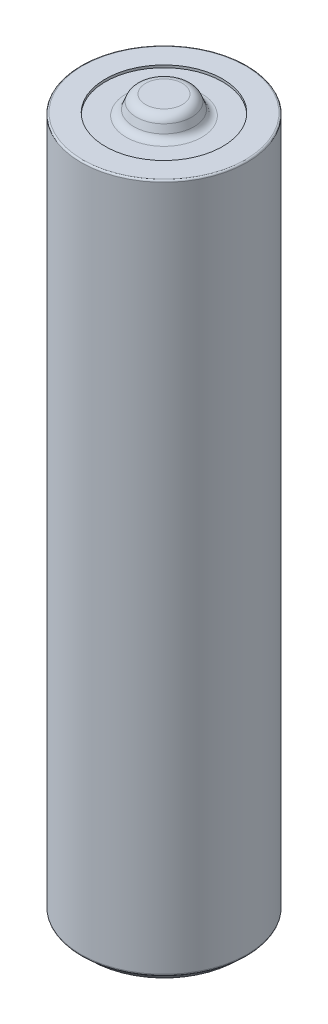
ISO-10303-21;
HEADER;
FILE_DESCRIPTION(('STEP AP214'),'2;1');
FILE_NAME('part.step','',(''),(''),'','','');
FILE_SCHEMA(('AUTOMOTIVE_DESIGN { 1 0 10303 214 1 1 1 1 }'));
ENDSEC;
DATA;
#1=APPLICATION_CONTEXT('core data for automotive mechanical design processes');
#2=APPLICATION_PROTOCOL_DEFINITION('international standard','automotive_design',2000,#1);
#3=PRODUCT_CONTEXT('',#1,'mechanical');
#4=PRODUCT('Part','Part','',(#3));
#5=PRODUCT_RELATED_PRODUCT_CATEGORY('part','',(#4));
#6=PRODUCT_DEFINITION_FORMATION('','',#4);
#7=PRODUCT_DEFINITION_CONTEXT('part definition',#1,'design');
#8=PRODUCT_DEFINITION('design','',#6,#7);
#9=PRODUCT_DEFINITION_SHAPE('','',#8);
#10=(LENGTH_UNIT() NAMED_UNIT(*) SI_UNIT(.MILLI.,.METRE.));
#11=(NAMED_UNIT(*) PLANE_ANGLE_UNIT() SI_UNIT($,.RADIAN.));
#12=(NAMED_UNIT(*) SI_UNIT($,.STERADIAN.) SOLID_ANGLE_UNIT());
#13=UNCERTAINTY_MEASURE_WITH_UNIT(LENGTH_MEASURE(1.E-05),#10,'distance_accuracy_value','');
#14=(GEOMETRIC_REPRESENTATION_CONTEXT(3) GLOBAL_UNCERTAINTY_ASSIGNED_CONTEXT((#13)) GLOBAL_UNIT_ASSIGNED_CONTEXT((#10,
#11,#12)) REPRESENTATION_CONTEXT('',''));
#15=CARTESIAN_POINT('',(0.,0.,0.));
#16=DIRECTION('',(0.,0.,1.));
#17=DIRECTION('',(1.,0.,0.));
#18=AXIS2_PLACEMENT_3D('',#15,#16,#17);
#19=CARTESIAN_POINT('',(0.,0.5,0.));
#20=DIRECTION('',(0.,0.,1.));
#21=DIRECTION('',(0.,1.,0.));
#22=AXIS2_PLACEMENT_3D('',#19,#20,#21);
#23=SPHERICAL_SURFACE('',#22,0.5);
#24=CARTESIAN_POINT('',(0.,0.0999999999999999,0.3));
#25=CARTESIAN_POINT('',(-0.0168414312078831,0.0999999999998824,0.299998616022347));
#26=CARTESIAN_POINT('',(-0.033698143120343,0.0999999999999132,0.298576615277626));
#27=CARTESIAN_POINT('',(-0.0669618386199424,0.100000000000087,0.292919431710086));
#28=CARTESIAN_POINT('',(-0.083367781262767,0.10000000000023,0.288678228043507));
#29=CARTESIAN_POINT('',(-0.115207213805385,0.100000000000187,0.277508996164201));
#30=CARTESIAN_POINT('',(-0.130642382528368,0.100000000000001,0.270585763457816));
#31=CARTESIAN_POINT('',(-0.160153003373386,0.0999999999999987,0.254236154729416));
#32=CARTESIAN_POINT('',(-0.174226487653123,0.100000000000182,0.244806227727298));
#33=CARTESIAN_POINT('',(-0.200570613342623,0.100000000000202,0.223730999914236));
#34=CARTESIAN_POINT('',(-0.212843768885043,0.100000000000039,0.212088841659866));
#35=CARTESIAN_POINT('',(-0.2352786657801,0.0999999999999614,0.186892718818984));
#36=CARTESIAN_POINT('',(-0.245437427315066,0.100000000000048,0.173336100712787));
#37=CARTESIAN_POINT('',(-0.263320692618237,0.100000000000075,0.144728634714572));
#38=CARTESIAN_POINT('',(-0.271048516692503,0.100000000000016,0.129679862187264));
#39=CARTESIAN_POINT('',(-0.283878515182736,0.0999999999999844,0.0984779593801836));
#40=CARTESIAN_POINT('',(-0.288977137245286,0.100000000000013,0.0823233681992701));
#41=CARTESIAN_POINT('',(-0.296385469099331,0.100000000000023,0.0493983810219092));
#42=CARTESIAN_POINT('',(-0.298697053211926,0.100000000000004,0.032628406708507));
#43=CARTESIAN_POINT('',(-0.300471987927483,0.0999999999999963,-0.00106159913578849));
#44=CARTESIAN_POINT('',(-0.299935338530444,0.100000000000008,-0.0179816306666818));
#45=CARTESIAN_POINT('',(-0.296027676232927,0.10000000000001,-0.0515027931891387));
#46=CARTESIAN_POINT('',(-0.292654755078247,0.100000000000001,-0.0681037017800278));
#47=CARTESIAN_POINT('',(-0.28317438351328,0.0999999999999994,-0.100481011041763));
#48=CARTESIAN_POINT('',(-0.277070619297967,0.100000000000007,-0.116258491255821));
#49=CARTESIAN_POINT('',(-0.262292339792125,0.100000000000007,-0.146586708209472));
#50=CARTESIAN_POINT('',(-0.253614304503425,0.0999999999999979,-0.161135729961069));
#51=CARTESIAN_POINT('',(-0.233951137231907,0.100000000000002,-0.188549760269486));
#52=CARTESIAN_POINT('',(-0.222969247394558,0.100000000000015,-0.201417094546154));
#53=CARTESIAN_POINT('',(-0.198985481315581,0.100000000000006,-0.225143812616473));
#54=CARTESIAN_POINT('',(-0.185980774648988,0.099999999999985,-0.236000335427873));
#55=CARTESIAN_POINT('',(-0.158351489128396,0.100000000000015,-0.255360320703057));
#56=CARTESIAN_POINT('',(-0.143729240349114,0.100000000000066,-0.263867107714152));
#57=CARTESIAN_POINT('',(-0.113239696941085,0.100000000000027,-0.278320098691324));
#58=CARTESIAN_POINT('',(-0.0973702288857056,0.0999999999999367,-0.284261710104179));
#59=CARTESIAN_POINT('',(-0.0648851178024567,0.100000000000063,-0.293382824187584));
#60=CARTESIAN_POINT('',(-0.0482711426083209,0.10000000000028,-0.296568204991798));
#61=CARTESIAN_POINT('',(-0.0210523215817029,0.100000000000205,-0.299446459068294));
#62=CARTESIAN_POINT('',(-0.0105291471482584,0.100000000000073,-0.300000865253325));
#63=CARTESIAN_POINT('',(0.016841431207883,0.0999999999998825,-0.299998616022347));
#64=CARTESIAN_POINT('',(0.0336981431203428,0.0999999999999132,-0.298576615277626));
#65=CARTESIAN_POINT('',(0.0669618386199421,0.100000000000087,-0.292919431710086));
#66=CARTESIAN_POINT('',(0.0833677812627667,0.10000000000023,-0.288678228043507));
#67=CARTESIAN_POINT('',(0.115207213805385,0.100000000000187,-0.277508996164201));
#68=CARTESIAN_POINT('',(0.130642382528368,0.100000000000001,-0.270585763457816));
#69=CARTESIAN_POINT('',(0.160153003373386,0.0999999999999987,-0.254236154729416));
#70=CARTESIAN_POINT('',(0.174226487653123,0.100000000000182,-0.244806227727299));
#71=CARTESIAN_POINT('',(0.200570613342623,0.100000000000202,-0.223730999914236));
#72=CARTESIAN_POINT('',(0.212843768885043,0.100000000000039,-0.212088841659866));
#73=CARTESIAN_POINT('',(0.2352786657801,0.0999999999999614,-0.186892718818984));
#74=CARTESIAN_POINT('',(0.245437427315065,0.100000000000048,-0.173336100712787));
#75=CARTESIAN_POINT('',(0.263320692618237,0.100000000000075,-0.144728634714572));
#76=CARTESIAN_POINT('',(0.271048516692503,0.100000000000016,-0.129679862187264));
#77=CARTESIAN_POINT('',(0.283878515182736,0.0999999999999844,-0.0984779593801838));
#78=CARTESIAN_POINT('',(0.288977137245286,0.100000000000013,-0.0823233681992705));
#79=CARTESIAN_POINT('',(0.296385469099331,0.100000000000023,-0.0493983810219096));
#80=CARTESIAN_POINT('',(0.298697053211926,0.100000000000004,-0.0326284067085074));
#81=CARTESIAN_POINT('',(0.300471987927483,0.0999999999999963,0.00106159913578809));
#82=CARTESIAN_POINT('',(0.299935338530444,0.100000000000008,0.0179816306666814));
#83=CARTESIAN_POINT('',(0.296027676232927,0.10000000000001,0.0515027931891384));
#84=CARTESIAN_POINT('',(0.292654755078247,0.100000000000001,0.0681037017800275));
#85=CARTESIAN_POINT('',(0.28317438351328,0.0999999999999994,0.100481011041763));
#86=CARTESIAN_POINT('',(0.277070619297967,0.100000000000008,0.11625849125582));
#87=CARTESIAN_POINT('',(0.262292339792125,0.100000000000007,0.146586708209472));
#88=CARTESIAN_POINT('',(0.253614304503425,0.099999999999998,0.161135729961069));
#89=CARTESIAN_POINT('',(0.233951137231908,0.100000000000002,0.188549760269486));
#90=CARTESIAN_POINT('',(0.222969247394558,0.100000000000015,0.201417094546154));
#91=CARTESIAN_POINT('',(0.198985481315581,0.100000000000006,0.225143812616473));
#92=CARTESIAN_POINT('',(0.185980774648988,0.099999999999985,0.236000335427873));
#93=CARTESIAN_POINT('',(0.158351489128396,0.100000000000015,0.255360320703056));
#94=CARTESIAN_POINT('',(0.143729240349114,0.100000000000066,0.263867107714152));
#95=CARTESIAN_POINT('',(0.113239696941085,0.100000000000027,0.278320098691324));
#96=CARTESIAN_POINT('',(0.0973702288857059,0.0999999999999367,0.284261710104179));
#97=CARTESIAN_POINT('',(0.064885117802457,0.100000000000063,0.293382824187584));
#98=CARTESIAN_POINT('',(0.0482711426083212,0.10000000000028,0.296568204991798));
#99=CARTESIAN_POINT('',(0.021052321581703,0.100000000000205,0.299446459068294));
#100=CARTESIAN_POINT('',(0.0105291471482584,0.100000000000073,0.300000865253325));
#101=CARTESIAN_POINT('',(0.,0.0999999999999999,0.3));
#102=B_SPLINE_CURVE_WITH_KNOTS('',3,(#24,#25,#26,#27,#28,#29,#30,#31,#32,#33,#34,#35,#36,#37,
#38,#39,#40,#41,#42,#43,#44,#45,#46,#47,#48,#49,#50,#51,#52,#53,#54,#55,#56,#57,#58,#59,#60,#61,
#62,#63,#64,#65,#66,#67,#68,#69,#70,#71,#72,#73,#74,#75,#76,#77,#78,#79,#80,#81,#82,#83,#84,#85,
#86,#87,#88,#89,#90,#91,#92,#93,#94,#95,#96,#97,#98,#99,#100,#101),.UNSPECIFIED.,.T.,.F.,(4,2,2,
2,2,2,2,2,2,2,2,2,2,2,2,2,2,2,2,2,2,2,2,2,2,2,2,2,2,2,2,2,2,2,2,2,2,2,4),(0.,0.0504912894022492,
0.101090758704743,0.15160016992559,0.202181517587547,0.252691542574243,0.303272276474259,
0.353783621445608,0.40436303539111,0.454908414982387,0.505453794573672,0.556033208519124,
0.606544553490462,0.657125287390348,0.70763531237697,0.75821666003905,0.808726071259994,
0.859325540562679,0.909816829964956,0.941383637397138,0.991874926799387,1.04247439610188,
1.09298380732273,1.14356515498468,1.19407517997138,1.2446559138714,1.29516725884275,
1.34574667278825,1.39629205237952,1.44683743197081,1.49741684591626,1.5479281908876,
1.59850892478749,1.64901894977411,1.69960029743619,1.75010970865713,1.80070917795982,
1.85120046736209,1.88276727479428),.UNSPECIFIED.);
#103=CARTESIAN_POINT('',(0.,0.0999999999999999,0.3));
#104=VERTEX_POINT('',#103);
#105=EDGE_CURVE('E91',#104,#104,#102,.T.);
#106=ORIENTED_EDGE('',*,*,#105,.T.);
#107=EDGE_LOOP('',(#106));
#108=FACE_BOUND('',#107,.T.);
#109=ADVANCED_FACE('F17',(#108),#23,.T.);
#110=CARTESIAN_POINT('',(0.,0.1,0.3));
#111=DIRECTION('',(0.,1.,0.));
#112=DIRECTION('',(0.,0.,1.));
#113=AXIS2_PLACEMENT_3D('',#110,#111,#112);
#114=PLANE('',#113);
#115=CARTESIAN_POINT('',(0.,0.0999999999999999,0.));
#116=DIRECTION('',(0.,1.,0.));
#117=DIRECTION('',(0.,0.,-1.));
#118=AXIS2_PLACEMENT_3D('',#115,#116,#117);
#119=CIRCLE('',#118,2.49644660940673);
#120=CARTESIAN_POINT('',(0.,0.1,-2.49644660940673));
#121=VERTEX_POINT('',#120);
#122=CARTESIAN_POINT('',(0.,0.1,2.49644660940673));
#123=VERTEX_POINT('',#122);
#124=EDGE_CURVE('E83',#121,#123,#119,.T.);
#125=ORIENTED_EDGE('',*,*,#124,.F.);
#126=CARTESIAN_POINT('',(0.,0.0999999999999999,0.));
#127=DIRECTION('',(0.,1.,0.));
#128=DIRECTION('',(0.,0.,1.));
#129=AXIS2_PLACEMENT_3D('',#126,#127,#128);
#130=CIRCLE('',#129,2.49644660940673);
#131=EDGE_CURVE('E89',#123,#121,#130,.T.);
#132=ORIENTED_EDGE('',*,*,#131,.F.);
#133=EDGE_LOOP('',(#125,#132));
#134=FACE_BOUND('',#133,.T.);
#135=ORIENTED_EDGE('',*,*,#105,.F.);
#136=EDGE_LOOP('',(#135));
#137=FACE_BOUND('',#136,.T.);
#138=ADVANCED_FACE('F87',(#134,#137),#114,.F.);
#139=CARTESIAN_POINT('',(0.,0.35,0.));
#140=DIRECTION('',(0.,-1.,0.));
#141=DIRECTION('',(0.,0.,-1.));
#142=AXIS2_PLACEMENT_3D('',#139,#140,#141);
#143=TOROIDAL_SURFACE('',#142,2.49644660940673,0.25);
#144=ORIENTED_EDGE('',*,*,#124,.T.);
#145=ORIENTED_EDGE('',*,*,#131,.T.);
#146=EDGE_LOOP('',(#144,#145));
#147=FACE_BOUND('',#146,.T.);
#148=CARTESIAN_POINT('',(0.,0.173223304670955,0.));
#149=DIRECTION('',(0.,1.,0.));
#150=DIRECTION('',(0.,0.,1.));
#151=AXIS2_PLACEMENT_3D('',#148,#149,#150);
#152=CIRCLE('',#151,2.67322330466868);
#153=CARTESIAN_POINT('',(0.,0.173223304670955,2.67322330466868));
#154=VERTEX_POINT('',#153);
#155=EDGE_CURVE('E97',#154,#154,#152,.T.);
#156=ORIENTED_EDGE('',*,*,#155,.F.);
#157=EDGE_LOOP('',(#156));
#158=FACE_BOUND('',#157,.T.);
#159=ADVANCED_FACE('F95',(#147,#158),#143,.T.);
#160=CARTESIAN_POINT('',(0.,0.306066017174089,0.));
#161=DIRECTION('',(0.,1.,0.));
#162=DIRECTION('',(0.,0.,1.));
#163=AXIS2_PLACEMENT_3D('',#160,#161,#162);
#164=CONICAL_SURFACE('',#163,2.80606601717182,0.785398163397448);
#165=CARTESIAN_POINT('',(0.,0.306066017177981,0.));
#166=DIRECTION('',(0.,-1.,0.));
#167=DIRECTION('',(0.,0.,-1.));
#168=AXIS2_PLACEMENT_3D('',#165,#166,#167);
#169=CIRCLE('',#168,2.80606601717798);
#170=CARTESIAN_POINT('',(0.,0.306066017177981,-2.80606601717798));
#171=VERTEX_POINT('',#170);
#172=EDGE_CURVE('E122',#171,#171,#169,.T.);
#173=ORIENTED_EDGE('',*,*,#172,.T.);
#174=EDGE_LOOP('',(#173));
#175=FACE_BOUND('',#174,.T.);
#176=ORIENTED_EDGE('',*,*,#155,.T.);
#177=EDGE_LOOP('',(#176));
#178=FACE_BOUND('',#177,.T.);
#179=ADVANCED_FACE('F114',(#175,#178),#164,.T.);
#180=CARTESIAN_POINT('',(0.,0.2,0.));
#181=DIRECTION('',(0.,-1.,0.));
#182=DIRECTION('',(0.,0.,-1.));
#183=AXIS2_PLACEMENT_3D('',#180,#181,#182);
#184=TOROIDAL_SURFACE('',#183,2.91213203435596,0.15);
#185=ORIENTED_EDGE('',*,*,#172,.F.);
#186=EDGE_LOOP('',(#185));
#187=FACE_BOUND('',#186,.T.);
#188=CARTESIAN_POINT('',(0.,0.35,0.));
#189=DIRECTION('',(0.,-1.,0.));
#190=DIRECTION('',(0.,0.,1.));
#191=AXIS2_PLACEMENT_3D('',#188,#189,#190);
#192=CIRCLE('',#191,2.91213203435596);
#193=CARTESIAN_POINT('',(0.,0.35,2.91213203435596));
#194=VERTEX_POINT('',#193);
#195=CARTESIAN_POINT('',(0.,0.35,-2.91213203435596));
#196=VERTEX_POINT('',#195);
#197=EDGE_CURVE('E125',#194,#196,#192,.T.);
#198=ORIENTED_EDGE('',*,*,#197,.T.);
#199=CARTESIAN_POINT('',(0.,0.35,0.));
#200=DIRECTION('',(0.,-1.,0.));
#201=DIRECTION('',(0.,0.,-1.));
#202=AXIS2_PLACEMENT_3D('',#199,#200,#201);
#203=CIRCLE('',#202,2.91213203435596);
#204=EDGE_CURVE('E186',#196,#194,#203,.T.);
#205=ORIENTED_EDGE('',*,*,#204,.T.);
#206=EDGE_LOOP('',(#198,#205));
#207=FACE_BOUND('',#206,.T.);
#208=ADVANCED_FACE('F130',(#187,#207),#184,.F.);
#209=CARTESIAN_POINT('',(0.,44.2,1.12987547707417));
#210=DIRECTION('',(0.,-1.,0.));
#211=DIRECTION('',(0.,0.,-1.));
#212=AXIS2_PLACEMENT_3D('',#209,#210,#211);
#213=PLANE('',#212);
#214=CARTESIAN_POINT('',(0.,44.2,0.));
#215=DIRECTION('',(0.,-1.,0.));
#216=DIRECTION('',(0.,0.,1.));
#217=AXIS2_PLACEMENT_3D('',#214,#215,#216);
#218=CIRCLE('',#217,1.12987547707417);
#219=CARTESIAN_POINT('',(0.,44.2,1.12987547707417));
#220=VERTEX_POINT('',#219);
#221=CARTESIAN_POINT('',(0.,44.2,-1.12987547707417));
#222=VERTEX_POINT('',#221);
#223=EDGE_CURVE('E198',#220,#222,#218,.T.);
#224=ORIENTED_EDGE('',*,*,#223,.F.);
#225=CARTESIAN_POINT('',(0.,44.2,0.));
#226=DIRECTION('',(0.,-1.,0.));
#227=DIRECTION('',(0.,0.,-1.));
#228=AXIS2_PLACEMENT_3D('',#225,#226,#227);
#229=CIRCLE('',#228,1.12987547707417);
#230=EDGE_CURVE('E207',#222,#220,#229,.T.);
#231=ORIENTED_EDGE('',*,*,#230,.F.);
#232=EDGE_LOOP('',(#224,#231));
#233=FACE_BOUND('',#232,.T.);
#234=ADVANCED_FACE('F139',(#233),#213,.F.);
#235=CARTESIAN_POINT('',(0.,0.35,2.91213203435596));
#236=DIRECTION('',(0.,1.,0.));
#237=DIRECTION('',(0.,0.,1.));
#238=AXIS2_PLACEMENT_3D('',#235,#236,#237);
#239=PLANE('',#238);
#240=CARTESIAN_POINT('',(0.,0.35,0.));
#241=DIRECTION('',(0.,-1.,0.));
#242=DIRECTION('',(0.,0.,-1.));
#243=AXIS2_PLACEMENT_3D('',#240,#241,#242);
#244=CIRCLE('',#243,3.45);
#245=CARTESIAN_POINT('',(0.,0.35,-3.45));
#246=VERTEX_POINT('',#245);
#247=EDGE_CURVE('E216',#246,#246,#244,.T.);
#248=ORIENTED_EDGE('',*,*,#247,.T.);
#249=EDGE_LOOP('',(#248));
#250=FACE_BOUND('',#249,.T.);
#251=ORIENTED_EDGE('',*,*,#197,.F.);
#252=ORIENTED_EDGE('',*,*,#204,.F.);
#253=EDGE_LOOP('',(#251,#252));
#254=FACE_BOUND('',#253,.T.);
#255=ADVANCED_FACE('F163',(#250,#254),#239,.F.);
#256=CARTESIAN_POINT('',(0.,43.6,0.));
#257=DIRECTION('',(0.,-1.,0.));
#258=DIRECTION('',(0.,0.,-1.));
#259=AXIS2_PLACEMENT_3D('',#256,#257,#258);
#260=TOROIDAL_SURFACE('',#259,1.12987547707417,0.600000000000005);
#261=CARTESIAN_POINT('',(0.,43.8052120859425,0.));
#262=DIRECTION('',(0.,-1.,0.));
#263=DIRECTION('',(0.,0.,-1.));
#264=AXIS2_PLACEMENT_3D('',#261,#262,#263);
#265=CIRCLE('',#264,1.6936910495815);
#266=CARTESIAN_POINT('',(0.,43.8052120859425,-1.6936910495815));
#267=VERTEX_POINT('',#266);
#268=EDGE_CURVE('E171',#267,#267,#265,.T.);
#269=ORIENTED_EDGE('',*,*,#268,.F.);
#270=EDGE_LOOP('',(#269));
#271=FACE_BOUND('',#270,.T.);
#272=ORIENTED_EDGE('',*,*,#230,.T.);
#273=ORIENTED_EDGE('',*,*,#223,.T.);
#274=EDGE_LOOP('',(#272,#273));
#275=FACE_BOUND('',#274,.T.);
#276=ADVANCED_FACE('F152',(#271,#275),#260,.T.);
#277=CARTESIAN_POINT('',(0.,0.,0.));
#278=DIRECTION('',(0.,-1.,0.));
#279=DIRECTION('',(0.,0.,-1.));
#280=AXIS2_PLACEMENT_3D('',#277,#278,#279);
#281=CYLINDRICAL_SURFACE('',#280,3.45);
#282=ORIENTED_EDGE('',*,*,#247,.F.);
#283=EDGE_LOOP('',(#282));
#284=FACE_BOUND('',#283,.T.);
#285=CARTESIAN_POINT('',(0.,0.2,0.));
#286=DIRECTION('',(0.,-1.,0.));
#287=DIRECTION('',(0.,0.,-1.));
#288=AXIS2_PLACEMENT_3D('',#285,#286,#287);
#289=CIRCLE('',#288,3.45);
#290=CARTESIAN_POINT('',(0.,0.2,-3.45));
#291=VERTEX_POINT('',#290);
#292=EDGE_CURVE('E311',#291,#291,#289,.T.);
#293=ORIENTED_EDGE('',*,*,#292,.T.);
#294=EDGE_LOOP('',(#293));
#295=FACE_BOUND('',#294,.T.);
#296=ADVANCED_FACE('F162',(#284,#295),#281,.F.);
#297=CARTESIAN_POINT('',(0.,43.3789899284989,0.));
#298=DIRECTION('',(0.,-1.,0.));
#299=DIRECTION('',(0.,0.,-1.));
#300=AXIS2_PLACEMENT_3D('',#297,#298,#299);
#301=CONICAL_SURFACE('',#300,1.84882322807312,0.349065850393527);
#302=CARTESIAN_POINT('',(0.,43.3789899283372,0.));
#303=DIRECTION('',(0.,-1.,0.));
#304=DIRECTION('',(0.,0.,-1.));
#305=AXIS2_PLACEMENT_3D('',#302,#303,#304);
#306=CIRCLE('',#305,1.84882322811803);
#307=CARTESIAN_POINT('',(0.,43.3789899283372,-1.84882322811803));
#308=VERTEX_POINT('',#307);
#309=EDGE_CURVE('E304',#308,#308,#306,.F.);
#310=ORIENTED_EDGE('',*,*,#309,.T.);
#311=EDGE_LOOP('',(#310));
#312=FACE_BOUND('',#311,.T.);
#313=ORIENTED_EDGE('',*,*,#268,.T.);
#314=EDGE_LOOP('',(#313));
#315=FACE_BOUND('',#314,.T.);
#316=ADVANCED_FACE('F585',(#312,#315),#301,.T.);
#317=CARTESIAN_POINT('',(0.,0.2,3.45));
#318=DIRECTION('',(0.,1.,0.));
#319=DIRECTION('',(0.,0.,1.));
#320=AXIS2_PLACEMENT_3D('',#317,#318,#319);
#321=PLANE('',#320);
#322=CARTESIAN_POINT('',(0.,0.2,0.));
#323=DIRECTION('',(0.,1.,0.));
#324=DIRECTION('',(0.,0.,-1.));
#325=AXIS2_PLACEMENT_3D('',#322,#323,#324);
#326=CIRCLE('',#325,4.16491470389141);
#327=CARTESIAN_POINT('',(0.,0.2,-4.16491470389141));
#328=VERTEX_POINT('',#327);
#329=CARTESIAN_POINT('',(0.,0.2,4.16491470389141));
#330=VERTEX_POINT('',#329);
#331=EDGE_CURVE('E280',#328,#330,#326,.T.);
#332=ORIENTED_EDGE('',*,*,#331,.F.);
#333=CARTESIAN_POINT('',(0.,0.2,0.));
#334=DIRECTION('',(0.,1.,0.));
#335=DIRECTION('',(0.,0.,1.));
#336=AXIS2_PLACEMENT_3D('',#333,#334,#335);
#337=CIRCLE('',#336,4.16491470389141);
#338=EDGE_CURVE('E291',#330,#328,#337,.T.);
#339=ORIENTED_EDGE('',*,*,#338,.F.);
#340=EDGE_LOOP('',(#332,#339));
#341=FACE_BOUND('',#340,.T.);
#342=ORIENTED_EDGE('',*,*,#292,.F.);
#343=EDGE_LOOP('',(#342));
#344=FACE_BOUND('',#343,.T.);
#345=ADVANCED_FACE('F254',(#341,#344),#321,.F.);
#346=CARTESIAN_POINT('',(0.,43.55,0.));
#347=DIRECTION('',(0.,-1.,0.));
#348=DIRECTION('',(0.,0.,-1.));
#349=AXIS2_PLACEMENT_3D('',#346,#347,#348);
#350=TOROIDAL_SURFACE('',#349,2.31866953851099,0.500000000000001);
#351=CARTESIAN_POINT('',(0.,43.05,0.));
#352=DIRECTION('',(0.,1.,0.));
#353=DIRECTION('',(0.,0.,1.));
#354=AXIS2_PLACEMENT_3D('',#351,#352,#353);
#355=CIRCLE('',#354,2.31866953851099);
#356=CARTESIAN_POINT('',(0.,43.05,2.31866953851099));
#357=VERTEX_POINT('',#356);
#358=CARTESIAN_POINT('',(0.,43.05,-2.31866953851099));
#359=VERTEX_POINT('',#358);
#360=EDGE_CURVE('E267',#357,#359,#355,.T.);
#361=ORIENTED_EDGE('',*,*,#360,.T.);
#362=CARTESIAN_POINT('',(0.,43.05,0.));
#363=DIRECTION('',(0.,1.,0.));
#364=DIRECTION('',(0.,0.,-1.));
#365=AXIS2_PLACEMENT_3D('',#362,#363,#364);
#366=CIRCLE('',#365,2.31866953851099);
#367=EDGE_CURVE('E469',#359,#357,#366,.T.);
#368=ORIENTED_EDGE('',*,*,#367,.T.);
#369=EDGE_LOOP('',(#361,#368));
#370=FACE_BOUND('',#369,.T.);
#371=ORIENTED_EDGE('',*,*,#309,.F.);
#372=EDGE_LOOP('',(#371));
#373=FACE_BOUND('',#372,.T.);
#374=ADVANCED_FACE('F242',(#370,#373),#350,.F.);
#375=CARTESIAN_POINT('',(0.,0.7,0.));
#376=DIRECTION('',(0.,-1.,0.));
#377=DIRECTION('',(0.,0.,-1.));
#378=AXIS2_PLACEMENT_3D('',#375,#376,#377);
#379=TOROIDAL_SURFACE('',#378,4.16491470389141,0.5);
#380=ORIENTED_EDGE('',*,*,#331,.T.);
#381=ORIENTED_EDGE('',*,*,#338,.T.);
#382=EDGE_LOOP('',(#380,#381));
#383=FACE_BOUND('',#382,.T.);
#384=CARTESIAN_POINT('',(0.,0.449999999943885,0.));
#385=DIRECTION('',(0.,1.,0.));
#386=DIRECTION('',(0.,0.,1.));
#387=AXIS2_PLACEMENT_3D('',#384,#385,#386);
#388=CIRCLE('',#387,4.59792740576859);
#389=CARTESIAN_POINT('',(0.,0.449999999943884,4.59792740576859));
#390=VERTEX_POINT('',#389);
#391=EDGE_CURVE('E487',#390,#390,#388,.T.);
#392=ORIENTED_EDGE('',*,*,#391,.F.);
#393=EDGE_LOOP('',(#392));
#394=FACE_BOUND('',#393,.T.);
#395=ADVANCED_FACE('F253',(#383,#394),#379,.T.);
#396=CARTESIAN_POINT('',(0.,43.05,3.6));
#397=DIRECTION('',(0.,-1.,0.));
#398=DIRECTION('',(0.,0.,-1.));
#399=AXIS2_PLACEMENT_3D('',#396,#397,#398);
#400=PLANE('',#399);
#401=ORIENTED_EDGE('',*,*,#367,.F.);
#402=ORIENTED_EDGE('',*,*,#360,.F.);
#403=EDGE_LOOP('',(#401,#402));
#404=FACE_BOUND('',#403,.T.);
#405=CARTESIAN_POINT('',(0.,43.05,0.));
#406=DIRECTION('',(0.,-1.,0.));
#407=DIRECTION('',(0.,0.,-1.));
#408=AXIS2_PLACEMENT_3D('',#405,#406,#407);
#409=CIRCLE('',#408,3.6);
#410=CARTESIAN_POINT('',(0.,43.05,-3.6));
#411=VERTEX_POINT('',#410);
#412=EDGE_CURVE('E321',#411,#411,#409,.F.);
#413=ORIENTED_EDGE('',*,*,#412,.T.);
#414=EDGE_LOOP('',(#413));
#415=FACE_BOUND('',#414,.T.);
#416=ADVANCED_FACE('F474',(#404,#415),#400,.F.);
#417=CARTESIAN_POINT('',(0.,0.72499999998854,0.));
#418=DIRECTION('',(0.,1.,0.));
#419=DIRECTION('',(0.,0.,1.));
#420=AXIS2_PLACEMENT_3D('',#417,#418,#419);
#421=CONICAL_SURFACE('',#420,4.75669872980689,0.523598775558396);
#422=CARTESIAN_POINT('',(0.,0.724999999999998,0.));
#423=DIRECTION('',(0.,-1.,0.));
#424=DIRECTION('',(0.,0.,-1.));
#425=AXIS2_PLACEMENT_3D('',#422,#423,#424);
#426=CIRCLE('',#425,4.75669872981078);
#427=CARTESIAN_POINT('',(0.,0.724999999999998,-4.75669872981078));
#428=VERTEX_POINT('',#427);
#429=EDGE_CURVE('E463',#428,#428,#426,.T.);
#430=ORIENTED_EDGE('',*,*,#429,.T.);
#431=EDGE_LOOP('',(#430));
#432=FACE_BOUND('',#431,.T.);
#433=ORIENTED_EDGE('',*,*,#391,.T.);
#434=EDGE_LOOP('',(#433));
#435=FACE_BOUND('',#434,.T.);
#436=ADVANCED_FACE('F483',(#432,#435),#421,.T.);
#437=CARTESIAN_POINT('',(0.,0.,0.));
#438=DIRECTION('',(0.,-1.,0.));
#439=DIRECTION('',(0.,0.,-1.));
#440=AXIS2_PLACEMENT_3D('',#437,#438,#439);
#441=CYLINDRICAL_SURFACE('',#440,3.6);
#442=CARTESIAN_POINT('',(0.,43.2,0.));
#443=DIRECTION('',(0.,-1.,0.));
#444=DIRECTION('',(0.,0.,-1.));
#445=AXIS2_PLACEMENT_3D('',#442,#443,#444);
#446=CIRCLE('',#445,3.6);
#447=CARTESIAN_POINT('',(0.,43.2,-3.6));
#448=VERTEX_POINT('',#447);
#449=EDGE_CURVE('E466',#448,#448,#446,.F.);
#450=ORIENTED_EDGE('',*,*,#449,.T.);
#451=EDGE_LOOP('',(#450));
#452=FACE_BOUND('',#451,.T.);
#453=ORIENTED_EDGE('',*,*,#412,.F.);
#454=EDGE_LOOP('',(#453));
#455=FACE_BOUND('',#454,.T.);
#456=ADVANCED_FACE('F501',(#452,#455),#441,.F.);
#457=CARTESIAN_POINT('',(0.,0.649999999999999,0.));
#458=DIRECTION('',(0.,-1.,0.));
#459=DIRECTION('',(0.,0.,-1.));
#460=AXIS2_PLACEMENT_3D('',#457,#458,#459);
#461=TOROIDAL_SURFACE('',#460,4.88660254037844,0.15);
#462=ORIENTED_EDGE('',*,*,#429,.F.);
#463=EDGE_LOOP('',(#462));
#464=FACE_BOUND('',#463,.T.);
#465=CARTESIAN_POINT('',(0.,0.799999999999999,0.));
#466=DIRECTION('',(0.,-1.,0.));
#467=DIRECTION('',(0.,0.,1.));
#468=AXIS2_PLACEMENT_3D('',#465,#466,#467);
#469=CIRCLE('',#468,4.88660254037844);
#470=CARTESIAN_POINT('',(0.,0.799999999999999,4.88660254037844));
#471=VERTEX_POINT('',#470);
#472=CARTESIAN_POINT('',(0.,0.799999999999999,-4.88660254037844));
#473=VERTEX_POINT('',#472);
#474=EDGE_CURVE('E364',#471,#473,#469,.T.);
#475=ORIENTED_EDGE('',*,*,#474,.T.);
#476=CARTESIAN_POINT('',(0.,0.799999999999999,0.));
#477=DIRECTION('',(0.,-1.,0.));
#478=DIRECTION('',(0.,0.,-1.));
#479=AXIS2_PLACEMENT_3D('',#476,#477,#478);
#480=CIRCLE('',#479,4.88660254037844);
#481=EDGE_CURVE('E374',#473,#471,#480,.T.);
#482=ORIENTED_EDGE('',*,*,#481,.T.);
#483=EDGE_LOOP('',(#475,#482));
#484=FACE_BOUND('',#483,.T.);
#485=ADVANCED_FACE('F428',(#464,#484),#461,.F.);
#486=CARTESIAN_POINT('',(0.,43.2,5.));
#487=DIRECTION('',(0.,-1.,0.));
#488=DIRECTION('',(0.,0.,-1.));
#489=AXIS2_PLACEMENT_3D('',#486,#487,#488);
#490=PLANE('',#489);
#491=ORIENTED_EDGE('',*,*,#449,.F.);
#492=EDGE_LOOP('',(#491));
#493=FACE_BOUND('',#492,.T.);
#494=CARTESIAN_POINT('',(0.,43.2,0.));
#495=DIRECTION('',(0.,-1.,0.));
#496=DIRECTION('',(0.,0.,1.));
#497=AXIS2_PLACEMENT_3D('',#494,#495,#496);
#498=CIRCLE('',#497,5.);
#499=CARTESIAN_POINT('',(0.,43.2,5.));
#500=VERTEX_POINT('',#499);
#501=CARTESIAN_POINT('',(0.,43.2,-5.));
#502=VERTEX_POINT('',#501);
#503=EDGE_CURVE('E414',#500,#502,#498,.T.);
#504=ORIENTED_EDGE('',*,*,#503,.F.);
#505=CARTESIAN_POINT('',(0.,43.2,0.));
#506=DIRECTION('',(0.,-1.,0.));
#507=DIRECTION('',(0.,0.,-1.));
#508=AXIS2_PLACEMENT_3D('',#505,#506,#507);
#509=CIRCLE('',#508,5.);
#510=EDGE_CURVE('E331',#502,#500,#509,.T.);
#511=ORIENTED_EDGE('',*,*,#510,.F.);
#512=EDGE_LOOP('',(#504,#511));
#513=FACE_BOUND('',#512,.T.);
#514=ADVANCED_FACE('F419',(#493,#513),#490,.F.);
#515=CARTESIAN_POINT('',(0.,0.799999999999999,4.88660254037844));
#516=DIRECTION('',(0.,1.,0.));
#517=DIRECTION('',(0.,0.,1.));
#518=AXIS2_PLACEMENT_3D('',#515,#516,#517);
#519=PLANE('',#518);
#520=CARTESIAN_POINT('',(0.,0.8,0.));
#521=DIRECTION('',(0.,1.,0.));
#522=DIRECTION('',(0.,0.,-1.));
#523=AXIS2_PLACEMENT_3D('',#520,#521,#522);
#524=CIRCLE('',#523,4.94999999999999);
#525=CARTESIAN_POINT('',(0.,0.799999999999999,-4.94999999999999));
#526=VERTEX_POINT('',#525);
#527=CARTESIAN_POINT('',(0.,0.799999999999999,4.94999999999999));
#528=VERTEX_POINT('',#527);
#529=EDGE_CURVE('E385',#526,#528,#524,.T.);
#530=ORIENTED_EDGE('',*,*,#529,.F.);
#531=CARTESIAN_POINT('',(0.,0.8,0.));
#532=DIRECTION('',(0.,1.,0.));
#533=DIRECTION('',(0.,0.,1.));
#534=AXIS2_PLACEMENT_3D('',#531,#532,#533);
#535=CIRCLE('',#534,4.94999999999999);
#536=EDGE_CURVE('E38',#528,#526,#535,.T.);
#537=ORIENTED_EDGE('',*,*,#536,.F.);
#538=EDGE_LOOP('',(#530,#537));
#539=FACE_BOUND('',#538,.T.);
#540=ORIENTED_EDGE('',*,*,#474,.F.);
#541=ORIENTED_EDGE('',*,*,#481,.F.);
#542=EDGE_LOOP('',(#540,#541));
#543=FACE_BOUND('',#542,.T.);
#544=ADVANCED_FACE('F349',(#539,#543),#519,.F.);
#545=CARTESIAN_POINT('',(0.,43.1,0.));
#546=DIRECTION('',(0.,-1.,0.));
#547=DIRECTION('',(0.,0.,-1.));
#548=AXIS2_PLACEMENT_3D('',#545,#546,#547);
#549=TOROIDAL_SURFACE('',#548,5.,0.100000000000002);
#550=ORIENTED_EDGE('',*,*,#510,.T.);
#551=ORIENTED_EDGE('',*,*,#503,.T.);
#552=EDGE_LOOP('',(#550,#551));
#553=FACE_BOUND('',#552,.T.);
#554=CARTESIAN_POINT('',(0.,43.1,0.));
#555=DIRECTION('',(0.,-1.,0.));
#556=DIRECTION('',(0.,0.,-1.));
#557=AXIS2_PLACEMENT_3D('',#554,#555,#556);
#558=CIRCLE('',#557,5.1);
#559=CARTESIAN_POINT('',(0.,43.1,-5.1));
#560=VERTEX_POINT('',#559);
#561=EDGE_CURVE('E30',#560,#560,#558,.T.);
#562=ORIENTED_EDGE('',*,*,#561,.F.);
#563=EDGE_LOOP('',(#562));
#564=FACE_BOUND('',#563,.T.);
#565=ADVANCED_FACE('F337',(#553,#564),#549,.T.);
#566=CARTESIAN_POINT('',(0.,0.95,0.));
#567=DIRECTION('',(0.,-1.,0.));
#568=DIRECTION('',(0.,0.,-1.));
#569=AXIS2_PLACEMENT_3D('',#566,#567,#568);
#570=TOROIDAL_SURFACE('',#569,4.94999999999999,0.15);
#571=ORIENTED_EDGE('',*,*,#529,.T.);
#572=ORIENTED_EDGE('',*,*,#536,.T.);
#573=EDGE_LOOP('',(#571,#572));
#574=FACE_BOUND('',#573,.T.);
#575=CARTESIAN_POINT('',(0.,0.949999999999999,0.));
#576=DIRECTION('',(0.,-1.,0.));
#577=DIRECTION('',(0.,0.,-1.));
#578=AXIS2_PLACEMENT_3D('',#575,#576,#577);
#579=CIRCLE('',#578,5.1);
#580=CARTESIAN_POINT('',(0.,0.949999999999999,-5.1));
#581=VERTEX_POINT('',#580);
#582=EDGE_CURVE('E10',#581,#581,#579,.F.);
#583=ORIENTED_EDGE('',*,*,#582,.F.);
#584=EDGE_LOOP('',(#583));
#585=FACE_BOUND('',#584,.T.);
#586=ADVANCED_FACE('F348',(#574,#585),#570,.T.);
#587=CARTESIAN_POINT('',(0.,0.,0.));
#588=DIRECTION('',(0.,-1.,0.));
#589=DIRECTION('',(0.,0.,-1.));
#590=AXIS2_PLACEMENT_3D('',#587,#588,#589);
#591=CYLINDRICAL_SURFACE('',#590,5.1);
#592=ORIENTED_EDGE('',*,*,#561,.T.);
#593=EDGE_LOOP('',(#592));
#594=FACE_BOUND('',#593,.T.);
#595=ORIENTED_EDGE('',*,*,#582,.T.);
#596=EDGE_LOOP('',(#595));
#597=FACE_BOUND('',#596,.T.);
#598=ADVANCED_FACE('F512',(#594,#597),#591,.T.);
#599=CLOSED_SHELL('',(#109,#138,#159,#179,#208,#234,#255,#276,#296,#316,#345,#374,#395,#416,
#436,#456,#485,#514,#544,#565,#586,#598));
#600=MANIFOLD_SOLID_BREP('B1',#599);
#601=ADVANCED_BREP_SHAPE_REPRESENTATION('',(#18,#600),#14);
#602=SHAPE_DEFINITION_REPRESENTATION(#9,#601);
ENDSEC;
END-ISO-10303-21;
